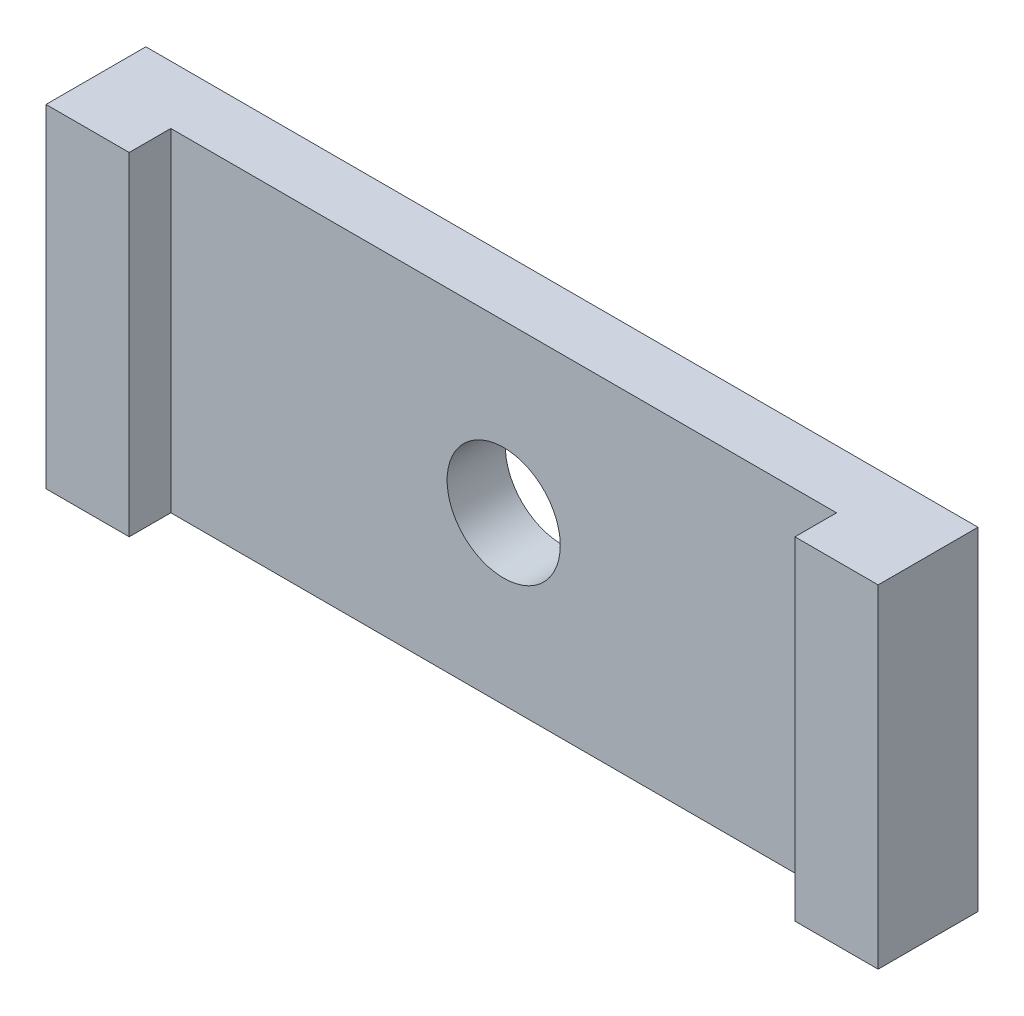
ISO-10303-21;
HEADER;
FILE_DESCRIPTION(('STEP AP214'),'2;1');
FILE_NAME('part.step','',(''),(''),'','','');
FILE_SCHEMA(('AUTOMOTIVE_DESIGN { 1 0 10303 214 1 1 1 1 }'));
ENDSEC;
DATA;
#1=APPLICATION_CONTEXT('core data for automotive mechanical design processes');
#2=APPLICATION_PROTOCOL_DEFINITION('international standard','automotive_design',2000,#1);
#3=PRODUCT_CONTEXT('',#1,'mechanical');
#4=PRODUCT('Part','Part','',(#3));
#5=PRODUCT_RELATED_PRODUCT_CATEGORY('part','',(#4));
#6=PRODUCT_DEFINITION_FORMATION('','',#4);
#7=PRODUCT_DEFINITION_CONTEXT('part definition',#1,'design');
#8=PRODUCT_DEFINITION('design','',#6,#7);
#9=PRODUCT_DEFINITION_SHAPE('','',#8);
#10=(LENGTH_UNIT() NAMED_UNIT(*) SI_UNIT(.MILLI.,.METRE.));
#11=(NAMED_UNIT(*) PLANE_ANGLE_UNIT() SI_UNIT($,.RADIAN.));
#12=(NAMED_UNIT(*) SI_UNIT($,.STERADIAN.) SOLID_ANGLE_UNIT());
#13=UNCERTAINTY_MEASURE_WITH_UNIT(LENGTH_MEASURE(1.E-05),#10,'distance_accuracy_value','');
#14=(GEOMETRIC_REPRESENTATION_CONTEXT(3) GLOBAL_UNCERTAINTY_ASSIGNED_CONTEXT((#13)) GLOBAL_UNIT_ASSIGNED_CONTEXT((#10,
#11,#12)) REPRESENTATION_CONTEXT('',''));
#15=CARTESIAN_POINT('',(0.,0.,0.));
#16=DIRECTION('',(0.,0.,1.));
#17=DIRECTION('',(1.,0.,0.));
#18=AXIS2_PLACEMENT_3D('',#15,#16,#17);
#19=CARTESIAN_POINT('',(0.,20.,-3.5));
#20=DIRECTION('',(0.,0.,-1.));
#21=DIRECTION('',(-1.,0.,0.));
#22=AXIS2_PLACEMENT_3D('',#19,#20,#21);
#23=PLANE('',#22);
#24=CARTESIAN_POINT('',(20.,10.,-3.5));
#25=DIRECTION('',(0.,0.,1.));
#26=DIRECTION('',(1.,0.,0.));
#27=AXIS2_PLACEMENT_3D('',#24,#25,#26);
#28=CIRCLE('',#27,3.4);
#29=CARTESIAN_POINT('',(23.4,10.,-3.5));
#30=VERTEX_POINT('',#29);
#31=EDGE_CURVE('E134',#30,#30,#28,.T.);
#32=ORIENTED_EDGE('',*,*,#31,.T.);
#33=EDGE_LOOP('',(#32));
#34=FACE_BOUND('',#33,.T.);
#35=DIRECTION('',(1.,0.,0.));
#36=VECTOR('',#35,1.);
#37=CARTESIAN_POINT('',(0.,0.,-3.5));
#38=LINE('',#37,#36);
#39=CARTESIAN_POINT('',(-5.,0.,-3.5));
#40=VERTEX_POINT('',#39);
#41=CARTESIAN_POINT('',(45.,0.,-3.50000000000001));
#42=VERTEX_POINT('',#41);
#43=EDGE_CURVE('E130',#40,#42,#38,.T.);
#44=ORIENTED_EDGE('',*,*,#43,.F.);
#45=DIRECTION('',(0.,-1.,0.));
#46=VECTOR('',#45,1.);
#47=CARTESIAN_POINT('',(-5.,20.,-3.5));
#48=LINE('',#47,#46);
#49=CARTESIAN_POINT('',(-5.,20.,-3.5));
#50=VERTEX_POINT('',#49);
#51=EDGE_CURVE('E11',#50,#40,#48,.T.);
#52=ORIENTED_EDGE('',*,*,#51,.F.);
#53=DIRECTION('',(1.,0.,0.));
#54=VECTOR('',#53,1.);
#55=CARTESIAN_POINT('',(0.,20.,-3.5));
#56=LINE('',#55,#54);
#57=CARTESIAN_POINT('',(45.,20.,-3.50000000000001));
#58=VERTEX_POINT('',#57);
#59=EDGE_CURVE('E149',#50,#58,#56,.T.);
#60=ORIENTED_EDGE('',*,*,#59,.T.);
#61=DIRECTION('',(0.,-1.,0.));
#62=VECTOR('',#61,1.);
#63=CARTESIAN_POINT('',(45.,20.,-3.50000000000001));
#64=LINE('',#63,#62);
#65=EDGE_CURVE('E88',#58,#42,#64,.T.);
#66=ORIENTED_EDGE('',*,*,#65,.T.);
#67=EDGE_LOOP('',(#44,#52,#60,#66));
#68=FACE_BOUND('',#67,.T.);
#69=ADVANCED_FACE('F37',(#34,#68),#23,.T.);
#70=CARTESIAN_POINT('',(-5.,20.,0.));
#71=DIRECTION('',(-1.,0.,0.));
#72=DIRECTION('',(0.,0.,1.));
#73=AXIS2_PLACEMENT_3D('',#70,#71,#72);
#74=PLANE('',#73);
#75=DIRECTION('',(0.,0.,-1.));
#76=VECTOR('',#75,1.);
#77=CARTESIAN_POINT('',(-5.,0.,0.));
#78=LINE('',#77,#76);
#79=CARTESIAN_POINT('',(-5.,0.,2.5));
#80=VERTEX_POINT('',#79);
#81=EDGE_CURVE('E133',#80,#40,#78,.T.);
#82=ORIENTED_EDGE('',*,*,#81,.F.);
#83=DIRECTION('',(0.,-1.,0.));
#84=VECTOR('',#83,1.);
#85=CARTESIAN_POINT('',(-5.,20.,2.5));
#86=LINE('',#85,#84);
#87=CARTESIAN_POINT('',(-5.,20.,2.5));
#88=VERTEX_POINT('',#87);
#89=EDGE_CURVE('E45',#88,#80,#86,.T.);
#90=ORIENTED_EDGE('',*,*,#89,.F.);
#91=DIRECTION('',(0.,0.,-1.));
#92=VECTOR('',#91,1.);
#93=CARTESIAN_POINT('',(-5.,20.,0.));
#94=LINE('',#93,#92);
#95=EDGE_CURVE('E175',#88,#50,#94,.T.);
#96=ORIENTED_EDGE('',*,*,#95,.T.);
#97=ORIENTED_EDGE('',*,*,#51,.T.);
#98=EDGE_LOOP('',(#82,#90,#96,#97));
#99=FACE_BOUND('',#98,.T.);
#100=ADVANCED_FACE('F166',(#99),#74,.T.);
#101=CARTESIAN_POINT('',(0.,20.,2.5));
#102=DIRECTION('',(0.,0.,1.));
#103=DIRECTION('',(1.,0.,0.));
#104=AXIS2_PLACEMENT_3D('',#101,#102,#103);
#105=PLANE('',#104);
#106=DIRECTION('',(-1.,0.,0.));
#107=VECTOR('',#106,1.);
#108=CARTESIAN_POINT('',(0.,0.,2.5));
#109=LINE('',#108,#107);
#110=CARTESIAN_POINT('',(0.,0.,2.5));
#111=VERTEX_POINT('',#110);
#112=EDGE_CURVE('E137',#111,#80,#109,.T.);
#113=ORIENTED_EDGE('',*,*,#112,.F.);
#114=DIRECTION('',(0.,-1.,0.));
#115=VECTOR('',#114,1.);
#116=CARTESIAN_POINT('',(0.,20.,2.5));
#117=LINE('',#116,#115);
#118=CARTESIAN_POINT('',(0.,20.,2.5));
#119=VERTEX_POINT('',#118);
#120=EDGE_CURVE('E155',#119,#111,#117,.T.);
#121=ORIENTED_EDGE('',*,*,#120,.F.);
#122=DIRECTION('',(-1.,0.,0.));
#123=VECTOR('',#122,1.);
#124=CARTESIAN_POINT('',(0.,20.,2.5));
#125=LINE('',#124,#123);
#126=EDGE_CURVE('E162',#119,#88,#125,.T.);
#127=ORIENTED_EDGE('',*,*,#126,.T.);
#128=ORIENTED_EDGE('',*,*,#89,.T.);
#129=EDGE_LOOP('',(#113,#121,#127,#128));
#130=FACE_BOUND('',#129,.T.);
#131=ADVANCED_FACE('F160',(#130),#105,.T.);
#132=CARTESIAN_POINT('',(0.,20.,0.));
#133=DIRECTION('',(1.,0.,0.));
#134=DIRECTION('',(0.,0.,-1.));
#135=AXIS2_PLACEMENT_3D('',#132,#133,#134);
#136=PLANE('',#135);
#137=DIRECTION('',(0.,0.,1.));
#138=VECTOR('',#137,1.);
#139=CARTESIAN_POINT('',(0.,0.,0.));
#140=LINE('',#139,#138);
#141=CARTESIAN_POINT('',(0.,0.,0.));
#142=VERTEX_POINT('',#141);
#143=EDGE_CURVE('E140',#142,#111,#140,.T.);
#144=ORIENTED_EDGE('',*,*,#143,.F.);
#145=DIRECTION('',(0.,-1.,0.));
#146=VECTOR('',#145,1.);
#147=CARTESIAN_POINT('',(0.,20.,0.));
#148=LINE('',#147,#146);
#149=CARTESIAN_POINT('',(0.,20.,0.));
#150=VERTEX_POINT('',#149);
#151=EDGE_CURVE('E153',#150,#142,#148,.T.);
#152=ORIENTED_EDGE('',*,*,#151,.F.);
#153=DIRECTION('',(0.,0.,1.));
#154=VECTOR('',#153,1.);
#155=CARTESIAN_POINT('',(0.,20.,0.));
#156=LINE('',#155,#154);
#157=EDGE_CURVE('E174',#150,#119,#156,.T.);
#158=ORIENTED_EDGE('',*,*,#157,.T.);
#159=ORIENTED_EDGE('',*,*,#120,.T.);
#160=EDGE_LOOP('',(#144,#152,#158,#159));
#161=FACE_BOUND('',#160,.T.);
#162=ADVANCED_FACE('F172',(#161),#136,.T.);
#163=CARTESIAN_POINT('',(0.,20.,0.));
#164=DIRECTION('',(0.,0.,-1.));
#165=DIRECTION('',(-1.,0.,0.));
#166=AXIS2_PLACEMENT_3D('',#163,#164,#165);
#167=PLANE('',#166);
#168=CARTESIAN_POINT('',(20.,10.,0.));
#169=DIRECTION('',(0.,0.,1.));
#170=DIRECTION('',(1.,0.,0.));
#171=AXIS2_PLACEMENT_3D('',#168,#169,#170);
#172=CIRCLE('',#171,3.39999999999999);
#173=CARTESIAN_POINT('',(23.4,10.,0.));
#174=VERTEX_POINT('',#173);
#175=EDGE_CURVE('E183',#174,#174,#172,.T.);
#176=ORIENTED_EDGE('',*,*,#175,.F.);
#177=EDGE_LOOP('',(#176));
#178=FACE_BOUND('',#177,.T.);
#179=DIRECTION('',(1.,0.,0.));
#180=VECTOR('',#179,1.);
#181=CARTESIAN_POINT('',(0.,0.,0.));
#182=LINE('',#181,#180);
#183=CARTESIAN_POINT('',(40.,0.,0.));
#184=VERTEX_POINT('',#183);
#185=EDGE_CURVE('E143',#142,#184,#182,.T.);
#186=ORIENTED_EDGE('',*,*,#185,.T.);
#187=DIRECTION('',(0.,-1.,0.));
#188=VECTOR('',#187,1.);
#189=CARTESIAN_POINT('',(40.,20.,0.));
#190=LINE('',#189,#188);
#191=CARTESIAN_POINT('',(40.,20.,0.));
#192=VERTEX_POINT('',#191);
#193=EDGE_CURVE('E122',#192,#184,#190,.T.);
#194=ORIENTED_EDGE('',*,*,#193,.F.);
#195=DIRECTION('',(1.,0.,0.));
#196=VECTOR('',#195,1.);
#197=CARTESIAN_POINT('',(0.,20.,0.));
#198=LINE('',#197,#196);
#199=EDGE_CURVE('E113',#150,#192,#198,.T.);
#200=ORIENTED_EDGE('',*,*,#199,.F.);
#201=ORIENTED_EDGE('',*,*,#151,.T.);
#202=EDGE_LOOP('',(#186,#194,#200,#201));
#203=FACE_BOUND('',#202,.T.);
#204=ADVANCED_FACE('F189',(#178,#203),#167,.F.);
#205=CARTESIAN_POINT('',(40.,20.,0.));
#206=DIRECTION('',(1.,0.,0.));
#207=DIRECTION('',(0.,0.,-1.));
#208=AXIS2_PLACEMENT_3D('',#205,#206,#207);
#209=PLANE('',#208);
#210=DIRECTION('',(0.,0.,1.));
#211=VECTOR('',#210,1.);
#212=CARTESIAN_POINT('',(40.,0.,0.));
#213=LINE('',#212,#211);
#214=CARTESIAN_POINT('',(40.,0.,2.5));
#215=VERTEX_POINT('',#214);
#216=EDGE_CURVE('E121',#184,#215,#213,.T.);
#217=ORIENTED_EDGE('',*,*,#216,.T.);
#218=DIRECTION('',(0.,-1.,0.));
#219=VECTOR('',#218,1.);
#220=CARTESIAN_POINT('',(40.,20.,2.5));
#221=LINE('',#220,#219);
#222=CARTESIAN_POINT('',(40.,20.,2.5));
#223=VERTEX_POINT('',#222);
#224=EDGE_CURVE('E118',#223,#215,#221,.T.);
#225=ORIENTED_EDGE('',*,*,#224,.F.);
#226=DIRECTION('',(0.,0.,1.));
#227=VECTOR('',#226,1.);
#228=CARTESIAN_POINT('',(40.,20.,0.));
#229=LINE('',#228,#227);
#230=EDGE_CURVE('E106',#192,#223,#229,.T.);
#231=ORIENTED_EDGE('',*,*,#230,.F.);
#232=ORIENTED_EDGE('',*,*,#193,.T.);
#233=EDGE_LOOP('',(#217,#225,#231,#232));
#234=FACE_BOUND('',#233,.T.);
#235=ADVANCED_FACE('F119',(#234),#209,.F.);
#236=CARTESIAN_POINT('',(0.,20.,2.5));
#237=DIRECTION('',(0.,0.,-1.));
#238=DIRECTION('',(-1.,0.,0.));
#239=AXIS2_PLACEMENT_3D('',#236,#237,#238);
#240=PLANE('',#239);
#241=DIRECTION('',(1.,0.,0.));
#242=VECTOR('',#241,1.);
#243=CARTESIAN_POINT('',(0.,0.,2.5));
#244=LINE('',#243,#242);
#245=CARTESIAN_POINT('',(45.,0.,2.49999999999999));
#246=VERTEX_POINT('',#245);
#247=EDGE_CURVE('E81',#215,#246,#244,.T.);
#248=ORIENTED_EDGE('',*,*,#247,.T.);
#249=DIRECTION('',(0.,-1.,0.));
#250=VECTOR('',#249,1.);
#251=CARTESIAN_POINT('',(45.,20.,2.49999999999999));
#252=LINE('',#251,#250);
#253=CARTESIAN_POINT('',(45.,20.,2.49999999999999));
#254=VERTEX_POINT('',#253);
#255=EDGE_CURVE('E123',#254,#246,#252,.T.);
#256=ORIENTED_EDGE('',*,*,#255,.F.);
#257=DIRECTION('',(1.,0.,0.));
#258=VECTOR('',#257,1.);
#259=CARTESIAN_POINT('',(0.,20.,2.5));
#260=LINE('',#259,#258);
#261=EDGE_CURVE('E110',#223,#254,#260,.T.);
#262=ORIENTED_EDGE('',*,*,#261,.F.);
#263=ORIENTED_EDGE('',*,*,#224,.T.);
#264=EDGE_LOOP('',(#248,#256,#262,#263));
#265=FACE_BOUND('',#264,.T.);
#266=ADVANCED_FACE('F125',(#265),#240,.F.);
#267=CARTESIAN_POINT('',(45.,20.,0.));
#268=DIRECTION('',(-1.,0.,0.));
#269=DIRECTION('',(0.,0.,1.));
#270=AXIS2_PLACEMENT_3D('',#267,#268,#269);
#271=PLANE('',#270);
#272=DIRECTION('',(0.,0.,-1.));
#273=VECTOR('',#272,1.);
#274=CARTESIAN_POINT('',(45.,0.,0.));
#275=LINE('',#274,#273);
#276=EDGE_CURVE('E147',#246,#42,#275,.T.);
#277=ORIENTED_EDGE('',*,*,#276,.T.);
#278=ORIENTED_EDGE('',*,*,#65,.F.);
#279=DIRECTION('',(0.,0.,-1.));
#280=VECTOR('',#279,1.);
#281=CARTESIAN_POINT('',(45.,20.,0.));
#282=LINE('',#281,#280);
#283=EDGE_CURVE('E53',#254,#58,#282,.T.);
#284=ORIENTED_EDGE('',*,*,#283,.F.);
#285=ORIENTED_EDGE('',*,*,#255,.T.);
#286=EDGE_LOOP('',(#277,#278,#284,#285));
#287=FACE_BOUND('',#286,.T.);
#288=ADVANCED_FACE('F195',(#287),#271,.F.);
#289=CARTESIAN_POINT('',(0.,20.,0.));
#290=DIRECTION('',(0.,1.,0.));
#291=DIRECTION('',(0.,0.,1.));
#292=AXIS2_PLACEMENT_3D('',#289,#290,#291);
#293=PLANE('',#292);
#294=ORIENTED_EDGE('',*,*,#59,.F.);
#295=ORIENTED_EDGE('',*,*,#95,.F.);
#296=ORIENTED_EDGE('',*,*,#126,.F.);
#297=ORIENTED_EDGE('',*,*,#157,.F.);
#298=ORIENTED_EDGE('',*,*,#199,.T.);
#299=ORIENTED_EDGE('',*,*,#230,.T.);
#300=ORIENTED_EDGE('',*,*,#261,.T.);
#301=ORIENTED_EDGE('',*,*,#283,.T.);
#302=EDGE_LOOP('',(#294,#295,#296,#297,#298,#299,#300,#301));
#303=FACE_BOUND('',#302,.T.);
#304=ADVANCED_FACE('F108',(#303),#293,.T.);
#305=CARTESIAN_POINT('',(0.,0.,0.));
#306=DIRECTION('',(0.,1.,0.));
#307=DIRECTION('',(0.,0.,1.));
#308=AXIS2_PLACEMENT_3D('',#305,#306,#307);
#309=PLANE('',#308);
#310=ORIENTED_EDGE('',*,*,#43,.T.);
#311=ORIENTED_EDGE('',*,*,#276,.F.);
#312=ORIENTED_EDGE('',*,*,#247,.F.);
#313=ORIENTED_EDGE('',*,*,#216,.F.);
#314=ORIENTED_EDGE('',*,*,#185,.F.);
#315=ORIENTED_EDGE('',*,*,#143,.T.);
#316=ORIENTED_EDGE('',*,*,#112,.T.);
#317=ORIENTED_EDGE('',*,*,#81,.T.);
#318=EDGE_LOOP('',(#310,#311,#312,#313,#314,#315,#316,#317));
#319=FACE_BOUND('',#318,.T.);
#320=ADVANCED_FACE('F168',(#319),#309,.F.);
#321=CARTESIAN_POINT('',(20.,10.,0.));
#322=DIRECTION('',(0.,0.,1.));
#323=DIRECTION('',(1.,0.,0.));
#324=AXIS2_PLACEMENT_3D('',#321,#322,#323);
#325=CYLINDRICAL_SURFACE('',#324,3.39999999999999);
#326=ORIENTED_EDGE('',*,*,#31,.F.);
#327=EDGE_LOOP('',(#326));
#328=FACE_BOUND('',#327,.T.);
#329=ORIENTED_EDGE('',*,*,#175,.T.);
#330=EDGE_LOOP('',(#329));
#331=FACE_BOUND('',#330,.T.);
#332=ADVANCED_FACE('F187',(#328,#331),#325,.F.);
#333=CLOSED_SHELL('',(#69,#100,#131,#162,#204,#235,#266,#288,#304,#320,#332));
#334=MANIFOLD_SOLID_BREP('B2',#333);
#335=ADVANCED_BREP_SHAPE_REPRESENTATION('',(#18,#334),#14);
#336=SHAPE_DEFINITION_REPRESENTATION(#9,#335);
ENDSEC;
END-ISO-10303-21;
